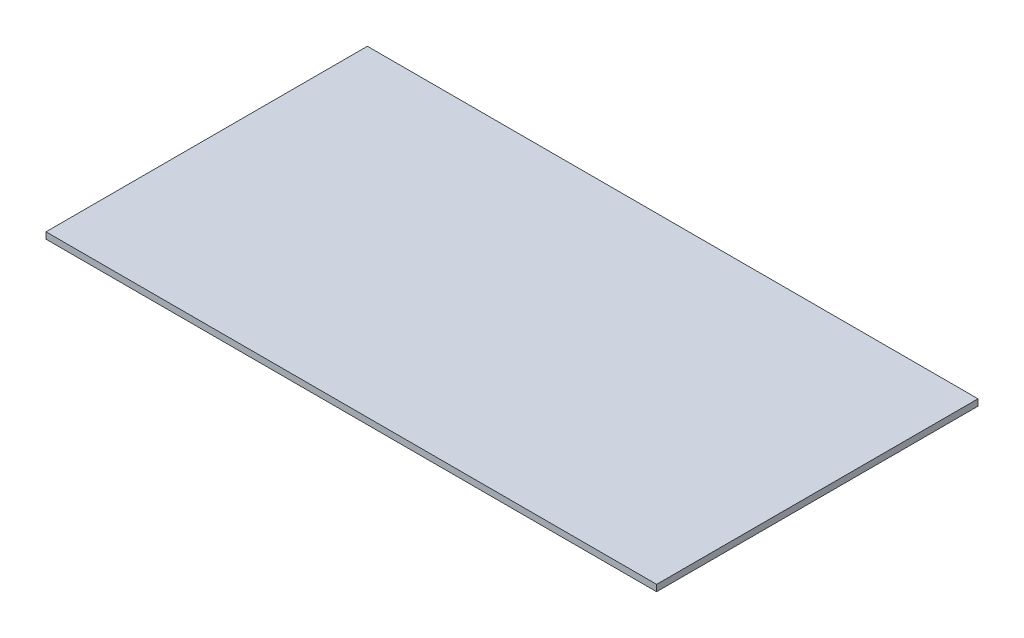
ISO-10303-21;
HEADER;
FILE_DESCRIPTION(('STEP AP214'),'2;1');
FILE_NAME('part.step','',(''),(''),'','','');
FILE_SCHEMA(('AUTOMOTIVE_DESIGN { 1 0 10303 214 1 1 1 1 }'));
ENDSEC;
DATA;
#1=APPLICATION_CONTEXT('core data for automotive mechanical design processes');
#2=APPLICATION_PROTOCOL_DEFINITION('international standard','automotive_design',2000,#1);
#3=PRODUCT_CONTEXT('',#1,'mechanical');
#4=PRODUCT('Part','Part','',(#3));
#5=PRODUCT_RELATED_PRODUCT_CATEGORY('part','',(#4));
#6=PRODUCT_DEFINITION_FORMATION('','',#4);
#7=PRODUCT_DEFINITION_CONTEXT('part definition',#1,'design');
#8=PRODUCT_DEFINITION('design','',#6,#7);
#9=PRODUCT_DEFINITION_SHAPE('','',#8);
#10=(LENGTH_UNIT() NAMED_UNIT(*) SI_UNIT(.MILLI.,.METRE.));
#11=(NAMED_UNIT(*) PLANE_ANGLE_UNIT() SI_UNIT($,.RADIAN.));
#12=(NAMED_UNIT(*) SI_UNIT($,.STERADIAN.) SOLID_ANGLE_UNIT());
#13=UNCERTAINTY_MEASURE_WITH_UNIT(LENGTH_MEASURE(1.E-05),#10,'distance_accuracy_value','');
#14=(GEOMETRIC_REPRESENTATION_CONTEXT(3) GLOBAL_UNCERTAINTY_ASSIGNED_CONTEXT((#13)) GLOBAL_UNIT_ASSIGNED_CONTEXT((#10,
#11,#12)) REPRESENTATION_CONTEXT('',''));
#15=CARTESIAN_POINT('',(0.,0.,0.));
#16=DIRECTION('',(0.,0.,1.));
#17=DIRECTION('',(1.,0.,0.));
#18=AXIS2_PLACEMENT_3D('',#15,#16,#17);
#19=CARTESIAN_POINT('',(0.,2.,0.));
#20=DIRECTION('',(1.,0.,0.));
#21=DIRECTION('',(0.,0.,-1.));
#22=AXIS2_PLACEMENT_3D('',#19,#20,#21);
#23=PLANE('',#22);
#24=DIRECTION('',(0.,0.,1.));
#25=VECTOR('',#24,1.);
#26=CARTESIAN_POINT('',(0.,0.,0.));
#27=LINE('',#26,#25);
#28=CARTESIAN_POINT('',(0.,0.,-100.));
#29=VERTEX_POINT('',#28);
#30=CARTESIAN_POINT('',(0.,0.,0.));
#31=VERTEX_POINT('',#30);
#32=EDGE_CURVE('E97',#29,#31,#27,.T.);
#33=ORIENTED_EDGE('',*,*,#32,.T.);
#34=DIRECTION('',(0.,-1.,0.));
#35=VECTOR('',#34,1.);
#36=CARTESIAN_POINT('',(0.,2.,0.));
#37=LINE('',#36,#35);
#38=CARTESIAN_POINT('',(0.,2.,0.));
#39=VERTEX_POINT('',#38);
#40=EDGE_CURVE('E11',#39,#31,#37,.T.);
#41=ORIENTED_EDGE('',*,*,#40,.F.);
#42=DIRECTION('',(0.,0.,1.));
#43=VECTOR('',#42,1.);
#44=CARTESIAN_POINT('',(0.,2.,0.));
#45=LINE('',#44,#43);
#46=CARTESIAN_POINT('',(0.,2.,-100.));
#47=VERTEX_POINT('',#46);
#48=EDGE_CURVE('E85',#47,#39,#45,.T.);
#49=ORIENTED_EDGE('',*,*,#48,.F.);
#50=DIRECTION('',(0.,-1.,0.));
#51=VECTOR('',#50,1.);
#52=CARTESIAN_POINT('',(0.,2.,-100.));
#53=LINE('',#52,#51);
#54=EDGE_CURVE('E93',#47,#29,#53,.T.);
#55=ORIENTED_EDGE('',*,*,#54,.T.);
#56=EDGE_LOOP('',(#33,#41,#49,#55));
#57=FACE_BOUND('',#56,.T.);
#58=ADVANCED_FACE('F34',(#57),#23,.F.);
#59=CARTESIAN_POINT('',(0.,2.,0.));
#60=DIRECTION('',(0.,0.,-1.));
#61=DIRECTION('',(-1.,0.,0.));
#62=AXIS2_PLACEMENT_3D('',#59,#60,#61);
#63=PLANE('',#62);
#64=DIRECTION('',(1.,0.,0.));
#65=VECTOR('',#64,1.);
#66=CARTESIAN_POINT('',(0.,0.,0.));
#67=LINE('',#66,#65);
#68=CARTESIAN_POINT('',(190.,0.,0.));
#69=VERTEX_POINT('',#68);
#70=EDGE_CURVE('E89',#31,#69,#67,.T.);
#71=ORIENTED_EDGE('',*,*,#70,.T.);
#72=DIRECTION('',(0.,-1.,0.));
#73=VECTOR('',#72,1.);
#74=CARTESIAN_POINT('',(190.,2.,0.));
#75=LINE('',#74,#73);
#76=CARTESIAN_POINT('',(190.,2.,0.));
#77=VERTEX_POINT('',#76);
#78=EDGE_CURVE('E42',#77,#69,#75,.T.);
#79=ORIENTED_EDGE('',*,*,#78,.F.);
#80=DIRECTION('',(1.,0.,0.));
#81=VECTOR('',#80,1.);
#82=CARTESIAN_POINT('',(0.,2.,0.));
#83=LINE('',#82,#81);
#84=EDGE_CURVE('E80',#39,#77,#83,.T.);
#85=ORIENTED_EDGE('',*,*,#84,.F.);
#86=ORIENTED_EDGE('',*,*,#40,.T.);
#87=EDGE_LOOP('',(#71,#79,#85,#86));
#88=FACE_BOUND('',#87,.T.);
#89=ADVANCED_FACE('F88',(#88),#63,.F.);
#90=CARTESIAN_POINT('',(190.,2.,0.));
#91=DIRECTION('',(-1.,0.,0.));
#92=DIRECTION('',(0.,0.,1.));
#93=AXIS2_PLACEMENT_3D('',#90,#91,#92);
#94=PLANE('',#93);
#95=DIRECTION('',(0.,0.,-1.));
#96=VECTOR('',#95,1.);
#97=CARTESIAN_POINT('',(190.,0.,0.));
#98=LINE('',#97,#96);
#99=CARTESIAN_POINT('',(190.,0.,-100.));
#100=VERTEX_POINT('',#99);
#101=EDGE_CURVE('E67',#69,#100,#98,.T.);
#102=ORIENTED_EDGE('',*,*,#101,.T.);
#103=DIRECTION('',(0.,-1.,0.));
#104=VECTOR('',#103,1.);
#105=CARTESIAN_POINT('',(190.,2.,-100.));
#106=LINE('',#105,#104);
#107=CARTESIAN_POINT('',(190.,2.,-100.));
#108=VERTEX_POINT('',#107);
#109=EDGE_CURVE('E90',#108,#100,#106,.T.);
#110=ORIENTED_EDGE('',*,*,#109,.F.);
#111=DIRECTION('',(0.,0.,-1.));
#112=VECTOR('',#111,1.);
#113=CARTESIAN_POINT('',(190.,2.,0.));
#114=LINE('',#113,#112);
#115=EDGE_CURVE('E83',#77,#108,#114,.T.);
#116=ORIENTED_EDGE('',*,*,#115,.F.);
#117=ORIENTED_EDGE('',*,*,#78,.T.);
#118=EDGE_LOOP('',(#102,#110,#116,#117));
#119=FACE_BOUND('',#118,.T.);
#120=ADVANCED_FACE('F91',(#119),#94,.F.);
#121=CARTESIAN_POINT('',(0.,2.,-100.));
#122=DIRECTION('',(0.,0.,1.));
#123=DIRECTION('',(1.,0.,0.));
#124=AXIS2_PLACEMENT_3D('',#121,#122,#123);
#125=PLANE('',#124);
#126=DIRECTION('',(-1.,0.,0.));
#127=VECTOR('',#126,1.);
#128=CARTESIAN_POINT('',(0.,0.,-100.));
#129=LINE('',#128,#127);
#130=EDGE_CURVE('E73',#100,#29,#129,.T.);
#131=ORIENTED_EDGE('',*,*,#130,.T.);
#132=ORIENTED_EDGE('',*,*,#54,.F.);
#133=DIRECTION('',(-1.,0.,0.));
#134=VECTOR('',#133,1.);
#135=CARTESIAN_POINT('',(0.,2.,-100.));
#136=LINE('',#135,#134);
#137=EDGE_CURVE('E50',#108,#47,#136,.T.);
#138=ORIENTED_EDGE('',*,*,#137,.F.);
#139=ORIENTED_EDGE('',*,*,#109,.T.);
#140=EDGE_LOOP('',(#131,#132,#138,#139));
#141=FACE_BOUND('',#140,.T.);
#142=ADVANCED_FACE('F104',(#141),#125,.F.);
#143=CARTESIAN_POINT('',(0.,2.,0.));
#144=DIRECTION('',(0.,-1.,0.));
#145=DIRECTION('',(0.,0.,-1.));
#146=AXIS2_PLACEMENT_3D('',#143,#144,#145);
#147=PLANE('',#146);
#148=ORIENTED_EDGE('',*,*,#48,.T.);
#149=ORIENTED_EDGE('',*,*,#84,.T.);
#150=ORIENTED_EDGE('',*,*,#115,.T.);
#151=ORIENTED_EDGE('',*,*,#137,.T.);
#152=EDGE_LOOP('',(#148,#149,#150,#151));
#153=FACE_BOUND('',#152,.T.);
#154=ADVANCED_FACE('F81',(#153),#147,.F.);
#155=CARTESIAN_POINT('',(0.,0.,0.));
#156=DIRECTION('',(0.,-1.,0.));
#157=DIRECTION('',(0.,0.,-1.));
#158=AXIS2_PLACEMENT_3D('',#155,#156,#157);
#159=PLANE('',#158);
#160=ORIENTED_EDGE('',*,*,#32,.F.);
#161=ORIENTED_EDGE('',*,*,#130,.F.);
#162=ORIENTED_EDGE('',*,*,#101,.F.);
#163=ORIENTED_EDGE('',*,*,#70,.F.);
#164=EDGE_LOOP('',(#160,#161,#162,#163));
#165=FACE_BOUND('',#164,.T.);
#166=ADVANCED_FACE('F107',(#165),#159,.T.);
#167=CLOSED_SHELL('',(#58,#89,#120,#142,#154,#166));
#168=MANIFOLD_SOLID_BREP('B2',#167);
#169=ADVANCED_BREP_SHAPE_REPRESENTATION('',(#18,#168),#14);
#170=SHAPE_DEFINITION_REPRESENTATION(#9,#169);
ENDSEC;
END-ISO-10303-21;
